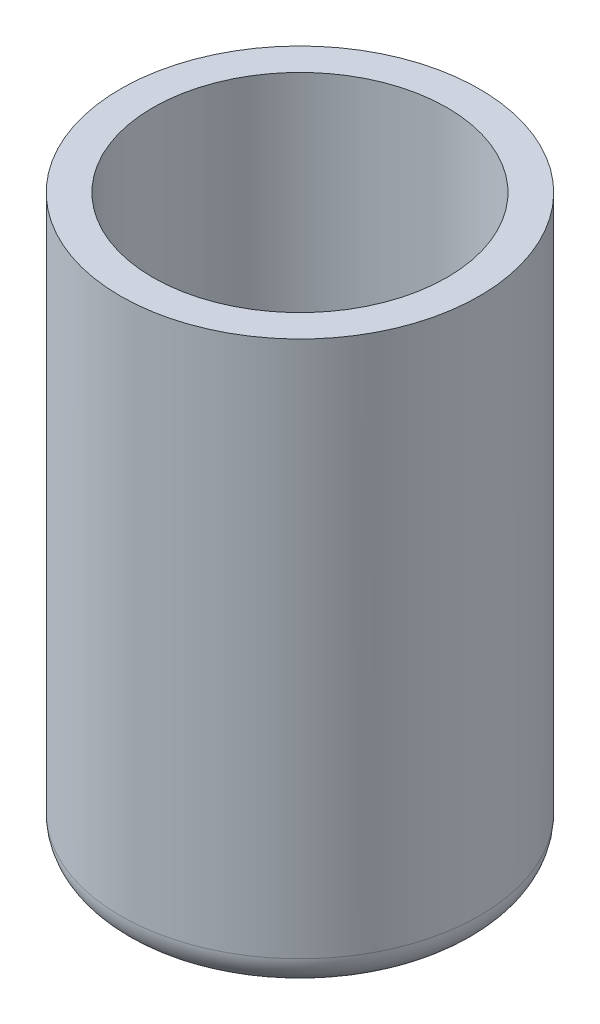
ISO-10303-21;
HEADER;
FILE_DESCRIPTION(('STEP AP214'),'2;1');
FILE_NAME('part.step','',(''),(''),'','','');
FILE_SCHEMA(('AUTOMOTIVE_DESIGN { 1 0 10303 214 1 1 1 1 }'));
ENDSEC;
DATA;
#1=APPLICATION_CONTEXT('core data for automotive mechanical design processes');
#2=APPLICATION_PROTOCOL_DEFINITION('international standard','automotive_design',2000,#1);
#3=PRODUCT_CONTEXT('',#1,'mechanical');
#4=PRODUCT('Part','Part','',(#3));
#5=PRODUCT_RELATED_PRODUCT_CATEGORY('part','',(#4));
#6=PRODUCT_DEFINITION_FORMATION('','',#4);
#7=PRODUCT_DEFINITION_CONTEXT('part definition',#1,'design');
#8=PRODUCT_DEFINITION('design','',#6,#7);
#9=PRODUCT_DEFINITION_SHAPE('','',#8);
#10=(LENGTH_UNIT() NAMED_UNIT(*) SI_UNIT(.MILLI.,.METRE.));
#11=(NAMED_UNIT(*) PLANE_ANGLE_UNIT() SI_UNIT($,.RADIAN.));
#12=(NAMED_UNIT(*) SI_UNIT($,.STERADIAN.) SOLID_ANGLE_UNIT());
#13=UNCERTAINTY_MEASURE_WITH_UNIT(LENGTH_MEASURE(1.E-05),#10,'distance_accuracy_value','');
#14=(GEOMETRIC_REPRESENTATION_CONTEXT(3) GLOBAL_UNCERTAINTY_ASSIGNED_CONTEXT((#13)) GLOBAL_UNIT_ASSIGNED_CONTEXT((#10,
#11,#12)) REPRESENTATION_CONTEXT('',''));
#15=CARTESIAN_POINT('',(0.,0.,0.));
#16=DIRECTION('',(0.,0.,1.));
#17=DIRECTION('',(1.,0.,0.));
#18=AXIS2_PLACEMENT_3D('',#15,#16,#17);
#19=CARTESIAN_POINT('',(0.,0.5,0.));
#20=DIRECTION('',(0.,1.,0.));
#21=DIRECTION('',(0.,0.,1.));
#22=AXIS2_PLACEMENT_3D('',#19,#20,#21);
#23=PLANE('',#22);
#24=CARTESIAN_POINT('',(0.,0.5,0.));
#25=DIRECTION('',(0.,-1.,0.));
#26=DIRECTION('',(0.,0.,-1.));
#27=AXIS2_PLACEMENT_3D('',#24,#25,#26);
#28=CIRCLE('',#27,1.5);
#29=CARTESIAN_POINT('',(0.,0.5,-1.5));
#30=VERTEX_POINT('',#29);
#31=EDGE_CURVE('E127',#30,#30,#28,.T.);
#32=ORIENTED_EDGE('',*,*,#31,.T.);
#33=EDGE_LOOP('',(#32));
#34=FACE_BOUND('',#33,.T.);
#35=CARTESIAN_POINT('',(0.,0.5,0.));
#36=DIRECTION('',(0.,1.,0.));
#37=DIRECTION('',(0.,0.,1.));
#38=AXIS2_PLACEMENT_3D('',#35,#36,#37);
#39=CIRCLE('',#38,2.275);
#40=CARTESIAN_POINT('',(0.,0.5,2.275));
#41=VERTEX_POINT('',#40);
#42=EDGE_CURVE('E50',#41,#41,#39,.T.);
#43=ORIENTED_EDGE('',*,*,#42,.T.);
#44=EDGE_LOOP('',(#43));
#45=FACE_BOUND('',#44,.T.);
#46=ADVANCED_FACE('F17',(#34,#45),#23,.T.);
#47=CARTESIAN_POINT('',(0.,0.,0.));
#48=DIRECTION('',(0.,-1.,0.));
#49=DIRECTION('',(0.,0.,-1.));
#50=AXIS2_PLACEMENT_3D('',#47,#48,#49);
#51=CYLINDRICAL_SURFACE('',#50,1.5);
#52=ORIENTED_EDGE('',*,*,#31,.F.);
#53=EDGE_LOOP('',(#52));
#54=FACE_BOUND('',#53,.T.);
#55=CARTESIAN_POINT('',(0.,0.,0.));
#56=DIRECTION('',(0.,-1.,0.));
#57=DIRECTION('',(0.,0.,-1.));
#58=AXIS2_PLACEMENT_3D('',#55,#56,#57);
#59=CIRCLE('',#58,1.5);
#60=CARTESIAN_POINT('',(0.,0.,-1.5));
#61=VERTEX_POINT('',#60);
#62=EDGE_CURVE('E120',#61,#61,#59,.T.);
#63=ORIENTED_EDGE('',*,*,#62,.T.);
#64=EDGE_LOOP('',(#63));
#65=FACE_BOUND('',#64,.T.);
#66=ADVANCED_FACE('F93',(#54,#65),#51,.F.);
#67=CARTESIAN_POINT('',(0.,8.8,0.));
#68=DIRECTION('',(0.,1.,0.));
#69=DIRECTION('',(0.,0.,1.));
#70=AXIS2_PLACEMENT_3D('',#67,#68,#69);
#71=CYLINDRICAL_SURFACE('',#70,2.275);
#72=ORIENTED_EDGE('',*,*,#42,.F.);
#73=EDGE_LOOP('',(#72));
#74=FACE_BOUND('',#73,.T.);
#75=CARTESIAN_POINT('',(0.,8.8,0.));
#76=DIRECTION('',(0.,1.,0.));
#77=DIRECTION('',(0.,0.,1.));
#78=AXIS2_PLACEMENT_3D('',#75,#76,#77);
#79=CIRCLE('',#78,2.275);
#80=CARTESIAN_POINT('',(0.,8.8,2.275));
#81=VERTEX_POINT('',#80);
#82=EDGE_CURVE('E115',#81,#81,#79,.F.);
#83=ORIENTED_EDGE('',*,*,#82,.F.);
#84=EDGE_LOOP('',(#83));
#85=FACE_BOUND('',#84,.T.);
#86=ADVANCED_FACE('F89',(#74,#85),#71,.F.);
#87=CARTESIAN_POINT('',(0.,0.,0.));
#88=DIRECTION('',(0.,1.,0.));
#89=DIRECTION('',(0.,0.,1.));
#90=AXIS2_PLACEMENT_3D('',#87,#88,#89);
#91=PLANE('',#90);
#92=ORIENTED_EDGE('',*,*,#62,.F.);
#93=EDGE_LOOP('',(#92));
#94=FACE_BOUND('',#93,.T.);
#95=DIRECTION('',(-0.00447098333713507,0.,-0.999990005104051));
#96=VECTOR('',#95,1.);
#97=CARTESIAN_POINT('',(-2.274909041772,0.,0.02034277072284));
#98=LINE('',#97,#96);
#99=CARTESIAN_POINT('',(-2.27499999538292,0.,2.657038677206E-12));
#100=VERTEX_POINT('',#99);
#101=CARTESIAN_POINT('',(-2.2749090417721,0.,0.0203427707228407));
#102=VERTEX_POINT('',#101);
#103=EDGE_CURVE('E45',#100,#102,#98,.F.);
#104=ORIENTED_EDGE('',*,*,#103,.F.);
#105=CARTESIAN_POINT('',(0.,0.,0.));
#106=DIRECTION('',(0.,1.,0.));
#107=DIRECTION('',(0.999960020616349,0.,-0.00894187726097398));
#108=AXIS2_PLACEMENT_3D('',#105,#106,#107);
#109=CIRCLE('',#108,2.2749999948696);
#110=CARTESIAN_POINT('',(2.2749090417722,0.,-0.0203427707228421));
#111=VERTEX_POINT('',#110);
#112=EDGE_CURVE('E36',#111,#100,#109,.T.);
#113=ORIENTED_EDGE('',*,*,#112,.F.);
#114=DIRECTION('',(0.00447098331750033,0.,0.999990005104138));
#115=VECTOR('',#114,1.);
#116=CARTESIAN_POINT('',(2.2749090417724,0.,-0.020342770722844));
#117=LINE('',#116,#115);
#118=CARTESIAN_POINT('',(2.27499999538288,0.,0.));
#119=VERTEX_POINT('',#118);
#120=EDGE_CURVE('E54',#119,#111,#117,.F.);
#121=ORIENTED_EDGE('',*,*,#120,.F.);
#122=CARTESIAN_POINT('',(-2.274909041772,0.,0.0203427707228401));
#123=CARTESIAN_POINT('',(-2.2749079122268,0.,0.0204690927999031));
#124=CARTESIAN_POINT('',(-2.27490677244794,0.,0.0205954148071511));
#125=CARTESIAN_POINT('',(-2.2749050309555,0.,0.0207867190812009));
#126=CARTESIAN_POINT('',(-2.27490443671498,0.,0.0208517014191717));
#127=CARTESIAN_POINT('',(-2.27490323172079,0.,0.0209828803077453));
#128=CARTESIAN_POINT('',(-2.27490262086606,0.,0.0210490768572435));
#129=CARTESIAN_POINT('',(-2.27455822120284,0.,0.0581948890568414));
#130=CARTESIAN_POINT('',(-2.27330749189729,5.01028851318519E-13,0.0952724837145068));
#131=CARTESIAN_POINT('',(-2.2689951644455,2.41395760941737E-12,0.169318804758169));
#132=CARTESIAN_POINT('',(-2.265933565353,3.82638218425559E-12,0.206287531087268));
#133=CARTESIAN_POINT('',(-2.25800680962578,7.47252325800651E-12,0.280032057933253));
#134=CARTESIAN_POINT('',(-2.25314165207901,9.70624017224398E-12,0.316807858352568));
#135=CARTESIAN_POINT('',(-2.24161941264226,1.49084030212427E-11,0.390077436430768));
#136=CARTESIAN_POINT('',(-2.2349623298763,1.78768493151786E-11,0.426571213951776));
#137=CARTESIAN_POINT('',(-2.21987215538289,2.44647165221028E-11,0.499189797518696));
#138=CARTESIAN_POINT('',(-2.21143906281715,2.80841377423574E-11,0.53531460339044));
#139=CARTESIAN_POINT('',(-2.1928170316152,3.58931163501653E-11,0.607108781864574));
#140=CARTESIAN_POINT('',(-2.18262809217979,4.00826739972251E-11,0.642778154259658));
#141=CARTESIAN_POINT('',(-2.1605187278213,4.89539619154424E-11,0.713576199939319));
#142=CARTESIAN_POINT('',(-2.14859830213927,5.36356924023301E-11,0.748704872986889));
#143=CARTESIAN_POINT('',(-2.12305446837299,6.34165109238919E-11,0.81833751404088));
#144=CARTESIAN_POINT('',(-2.10943105957096,6.85155991344733E-11,0.852841481783993));
#145=CARTESIAN_POINT('',(-2.08050057963175,7.90638936991614E-11,0.921173512521581));
#146=CARTESIAN_POINT('',(-2.06519197671435,8.45134166836478E-11,0.955000927001486));
#147=CARTESIAN_POINT('',(-2.03293796813301,9.56890096483312E-11,1.02186621899016));
#148=CARTESIAN_POINT('',(-2.01599256183378,1.01415079735865E-10,1.05490409619248));
#149=CARTESIAN_POINT('',(-1.9805055361723,1.13077625541851E-10,1.12011117547151));
#150=CARTESIAN_POINT('',(-1.96196391621744,1.19014101338419E-10,1.15228037722571));
#151=CARTESIAN_POINT('',(-1.92332887841285,1.31033929948697E-10,1.21567304339729));
#152=CARTESIAN_POINT('',(-1.90323546001318,1.37117282814459E-10,1.2468965074795));
#153=CARTESIAN_POINT('',(-1.86154495740937,1.49370566587445E-10,1.30832290287883));
#154=CARTESIAN_POINT('',(-1.83994787269772,1.55540497523891E-10,1.3385258338515));
#155=CARTESIAN_POINT('',(-1.79530177176338,1.67909321736227E-10,1.39783881189381));
#156=CARTESIAN_POINT('',(-1.77225275507514,1.74108215021403E-10,1.42694885861303));
#157=CARTESIAN_POINT('',(-1.72475800259924,1.86480515872509E-10,1.48400633507037));
#158=CARTESIAN_POINT('',(-1.70031226638731,1.92653923430696E-10,1.51195376445531));
#159=CARTESIAN_POINT('',(-1.65008263317409,2.04923665501069E-10,1.56661905815625));
#160=CARTESIAN_POINT('',(-1.62429873578891,2.11019999991144E-10,1.5933369221195));
#161=CARTESIAN_POINT('',(-1.57145454414962,2.23086962085974E-10,1.64547908229039));
#162=CARTESIAN_POINT('',(-1.54439424955088,2.29057589656785E-10,1.67090337814876));
#163=CARTESIAN_POINT('',(-1.48906208506205,2.40827393451631E-10,1.72039749813877));
#164=CARTESIAN_POINT('',(-1.46079021486527,2.46626569632263E-10,1.74446732192754));
#165=CARTESIAN_POINT('',(-1.40310262313302,2.58010779246847E-10,1.79119483842491));
#166=CARTESIAN_POINT('',(-1.37368690132732,2.63595812630203E-10,1.81385253079987));
#167=CARTESIAN_POINT('',(-1.31378207047109,2.7451194136831E-10,1.85770150786038));
#168=CARTESIAN_POINT('',(-1.28329296118508,2.79843036667347E-10,1.87889279222421));
#169=CARTESIAN_POINT('',(-1.2213143908048,2.90214420483579E-10,1.91975818942127));
#170=CARTESIAN_POINT('',(-1.18982492950793,2.95254708941879E-10,1.93943230194723));
#171=CARTESIAN_POINT('',(-1.12592108692678,3.05010572153766E-10,1.97721622600387));
#172=CARTESIAN_POINT('',(-1.0935067054708,3.0972614684707E-10,1.99532603724414));
#173=CARTESIAN_POINT('',(-1.02783067007742,3.18801682660338E-10,2.0299379765435));
#174=CARTESIAN_POINT('',(-0.994569015997028,3.23161643720283E-10,2.04644010433125));
#175=CARTESIAN_POINT('',(-0.927278112538879,3.31497843256083E-10,2.07779714574377));
#176=CARTESIAN_POINT('',(-0.893248863044526,3.35474081673652E-10,2.09265205911833));
#177=CARTESIAN_POINT('',(-0.82450428475113,3.43017903653596E-10,2.12067908662632));
#178=CARTESIAN_POINT('',(-0.78978895585945,3.46585487160794E-10,2.13385120053254));
#179=CARTESIAN_POINT('',(-0.719755378298236,3.53289783820274E-10,2.15848107517621));
#180=CARTESIAN_POINT('',(-0.684437129557468,3.56426496921648E-10,2.16993883571111));
#181=CARTESIAN_POINT('',(-0.613282316147296,3.62249923831323E-10,2.19111255642495));
#182=CARTESIAN_POINT('',(-0.5774457514254,3.64936637594049E-10,2.2008285164275));
#183=CARTESIAN_POINT('',(-0.505340151552807,3.69843871619921E-10,2.21849536138185));
#184=CARTESIAN_POINT('',(-0.469071116365609,3.72064391843719E-10,2.22644624618469));
#185=CARTESIAN_POINT('',(-0.396187457066522,3.76026000006789E-10,2.2405638942937));
#186=CARTESIAN_POINT('',(-0.359572832931298,3.77767087913686E-10,2.2467306574794));
#187=CARTESIAN_POINT('',(-0.28608570511639,3.80759400310325E-10,2.25726528978445));
#188=CARTESIAN_POINT('',(-0.249213201423644,3.82010624775254E-10,2.26163315881267));
#189=CARTESIAN_POINT('',(-0.175298641638568,3.84015940355227E-10,2.26855953949825));
#190=CARTESIAN_POINT('',(-0.138256585540511,3.84770031453478E-10,2.27111805109448));
#191=CARTESIAN_POINT('',(-0.0640916542629599,3.85776572508734E-10,2.27441958794257));
#192=CARTESIAN_POINT('',(-0.0269687790820996,3.86029022457259E-10,2.27516261316374));
#193=CARTESIAN_POINT('',(0.0472688634340816,3.860309108888E-10,2.27483139730175));
#194=CARTESIAN_POINT('',(0.0843836307694023,3.85780349371801E-10,2.27375715621855));
#195=CARTESIAN_POINT('',(0.158516150086931,3.84777530292941E-10,2.26979398106568));
#196=CARTESIAN_POINT('',(0.195533902070773,3.84025272739529E-10,2.26690504702657));
#197=CARTESIAN_POINT('',(0.26938371557892,3.82023626955579E-10,2.25931940639308));
#198=CARTESIAN_POINT('',(0.306215777109486,3.80774238741803E-10,2.25462269985965));
#199=CARTESIAN_POINT('',(0.3796059794308,3.77785642908933E-10,2.2434327652038));
#200=CARTESIAN_POINT('',(0.416164120235404,3.7604643531462E-10,2.23693953717227));
#201=CARTESIAN_POINT('',(0.488918907010033,3.72088408824714E-10,2.22217211406921));
#202=CARTESIAN_POINT('',(0.525115553004445,3.69869589961477E-10,2.21389791911784));
#203=CARTESIAN_POINT('',(0.597060642036865,3.64965779882122E-10,2.19558838304484));
#204=CARTESIAN_POINT('',(0.632809085112674,3.6228078870532E-10,2.18555304207174));
#205=CARTESIAN_POINT('',(0.703772133871904,3.56460684177648E-10,2.16374525366356));
#206=CARTESIAN_POINT('',(0.738986739609356,3.53325570872337E-10,2.15197280640429));
#207=CARTESIAN_POINT('',(0.808797758082489,3.46624510058231E-10,2.12671900638175));
#208=CARTESIAN_POINT('',(0.84339417089117,3.43058562600313E-10,2.11323765382027));
#209=CARTESIAN_POINT('',(0.911885928801196,3.35517773655512E-10,2.08459833784368));
#210=CARTESIAN_POINT('',(0.945781273997157,3.31542932223813E-10,2.06944037465484));
#211=CARTESIAN_POINT('',(1.01278970140954,3.23209579298475E-10,2.03748414840213));
#212=CARTESIAN_POINT('',(1.04590278374474,3.18851067863091E-10,2.02068588558731));
#213=CARTESIAN_POINT('',(1.11126736410305,3.09778242967149E-10,1.98548930040403));
#214=CARTESIAN_POINT('',(1.14351886227152,3.05063929566618E-10,1.96709097830551));
#215=CARTESIAN_POINT('',(1.20708301692058,2.95310422267054E-10,1.92873834782043));
#216=CARTESIAN_POINT('',(1.23839567357539,2.90271228428312E-10,1.90878403972263));
#217=CARTESIAN_POINT('',(1.3000071368507,2.79902021514089E-10,1.86736723786824));
#218=CARTESIAN_POINT('',(1.33030594367645,2.74572008497486E-10,1.84590474441699));
#219=CARTESIAN_POINT('',(1.38981712766148,2.63657826665094E-10,1.80152298533882));
#220=CARTESIAN_POINT('',(1.41902950505903,2.58073657905049E-10,1.77860372003142));
#221=CARTESIAN_POINT('',(1.47629785313637,2.46690976308572E-10,1.73136332041339));
#222=CARTESIAN_POINT('',(1.5043538240893,2.40892463522769E-10,1.7070421864339));
#223=CARTESIAN_POINT('',(1.55924215243888,2.29123924888423E-10,1.6570563108091));
#224=CARTESIAN_POINT('',(1.58607451014519,2.23153899083287E-10,1.63139156950383));
#225=CARTESIAN_POINT('',(1.63845133637134,2.11087937743574E-10,1.57877995916086));
#226=CARTESIAN_POINT('',(1.66399580523885,2.04992002242988E-10,1.55183309046926));
#227=CARTESIAN_POINT('',(1.71373566333907,1.92722846683345E-10,1.49672177660362));
#228=CARTESIAN_POINT('',(1.73793105295873,1.86549626646456E-10,1.4685573317788));
#229=CARTESIAN_POINT('',(1.78491479387946,1.74177448444257E-10,1.41107833357644));
#230=CARTESIAN_POINT('',(1.80770314560785,1.67978490286765E-10,1.38176378054819));
#231=CARTESIAN_POINT('',(1.85181822266759,1.55609456329772E-10,1.3220547889246));
#232=CARTESIAN_POINT('',(1.8731449484675,1.49439380521013E-10,1.29166035067545));
#233=CARTESIAN_POINT('',(1.91428568696252,1.37185512035207E-10,1.2298643984278));
#234=CARTESIAN_POINT('',(1.93409970016809,1.31101719329044E-10,1.19846288476914));
#235=CARTESIAN_POINT('',(1.97216755051832,1.19080753027284E-10,1.13472800393187));
#236=CARTESIAN_POINT('',(1.99042138821577,1.13143579379738E-10,1.10239463708345));
#237=CARTESIAN_POINT('',(2.02532516203188,1.01479446999039E-10,1.03687350430763));
#238=CARTESIAN_POINT('',(2.04197509874591,9.57524881878573E-11,1.00368573869738));
#239=CARTESIAN_POINT('',(2.07363118729849,8.45748382344395E-11,0.936535309505449));
#240=CARTESIAN_POINT('',(2.08863733977496,7.91241469849933E-11,0.902572646224481));
#241=CARTESIAN_POINT('',(2.11696991416989,6.85684771734286E-11,0.833953779008327));
#242=CARTESIAN_POINT('',(2.13029633676854,6.34634984713165E-11,0.799297575353994));
#243=CARTESIAN_POINT('',(2.15523752999224,5.36713210645016E-11,0.729374646048543));
#244=CARTESIAN_POINT('',(2.1668523013393,4.89841221835721E-11,0.69410792065496));
#245=CARTESIAN_POINT('',(2.1883423693376,4.01028207137349E-11,0.623048428892711));
#246=CARTESIAN_POINT('',(2.19821766675193,3.590871790851E-11,0.587255662754823));
#247=CARTESIAN_POINT('',(2.21620513711461,2.80915212735056E-11,0.515229830883956));
#248=CARTESIAN_POINT('',(2.22431731086618,2.44684271835938E-11,0.478996765351572));
#249=CARTESIAN_POINT('',(2.23875908532877,1.78744396991616E-11,0.406177129639672));
#250=CARTESIAN_POINT('',(2.24508868688195,1.49035459965153E-11,0.369590559627175));
#251=CARTESIAN_POINT('',(2.25595022217074,9.69786993252926E-12,0.296151560744809));
#252=CARTESIAN_POINT('',(2.26048215678597,7.46308721099924E-12,0.259299132005038));
#253=CARTESIAN_POINT('',(2.26773725771941,3.8165194335997E-12,0.185416682949238));
#254=CARTESIAN_POINT('',(2.2704604249532,2.40473396113735E-12,0.148386662723113));
#255=CARTESIAN_POINT('',(2.27409238813714,4.9463998807478E-13,0.074237780384874));
#256=CARTESIAN_POINT('',(2.27500118503632,0.,0.0371189183192395));
#257=CARTESIAN_POINT('',(2.27499999487,0.,0.));
#258=B_SPLINE_CURVE_WITH_KNOTS('',3,(#122,#123,#124,#125,#126,#127,#128,#129,#130,#131,#132,
#133,#134,#135,#136,#137,#138,#139,#140,#141,#142,#143,#144,#145,#146,#147,#148,#149,#150,#151,
#152,#153,#154,#155,#156,#157,#158,#159,#160,#161,#162,#163,#164,#165,#166,#167,#168,#169,#170,
#171,#172,#173,#174,#175,#176,#177,#178,#179,#180,#181,#182,#183,#184,#185,#186,#187,#188,#189,
#190,#191,#192,#193,#194,#195,#196,#197,#198,#199,#200,#201,#202,#203,#204,#205,#206,#207,#208,
#209,#210,#211,#212,#213,#214,#215,#216,#217,#218,#219,#220,#221,#222,#223,#224,#225,#226,#227,
#228,#229,#230,#231,#232,#233,#234,#235,#236,#237,#238,#239,#240,#241,#242,#243,#244,#245,#246,
#247,#248,#249,#250,#251,#252,#253,#254,#255,#256,#257),.UNSPECIFIED.,.F.,.F.,(4,2,2,2,2,2,2,2,
2,2,2,2,2,2,2,2,2,2,2,2,2,2,2,2,2,2,2,2,2,2,2,2,2,2,2,2,2,2,2,2,2,2,2,2,2,2,2,2,2,2,2,2,2,2,2,2,
2,2,2,2,2,2,2,2,2,2,2,4),(0.,0.000378981419826364,0.000573936580988481,0.000772534709615643,
0.11201614260098,0.223259808621649,0.334503530897943,0.445747307556157,0.556991136722589,
0.668235016523547,0.779478945085332,0.890722920534248,1.0020688609433,1.11341484456947,
1.22476086953389,1.33610693395771,1.44745303596209,1.55879917366816,1.67014534519707,
1.78149154866998,1.89283778220803,2.00418404393237,2.11553033196414,2.22687664442449,
2.33822297943458,2.44956933511553,2.56091570958852,2.67226210097467,2.78360850739515,
2.89495492697109,3.00630135782365,3.11764779807397,3.2289942458432,3.34034069925248,
3.45168715642297,3.56303361547581,3.67438007453215,3.78572653171314,3.89707298513992,
4.00841943293364,4.11976587321545,4.23111230410649,4.34245872372793,4.45380513020089,
4.56515152164652,4.67649789618599,4.78784425194043,4.89919058703099,5.01053689957882,
5.12188318770506,5.23322944953087,5.34457568317738,5.45592188676576,5.56726805841714,
5.67861419625268,5.78996029839351,5.90130636296079,6.01265238807567,6.12399837185929,
6.2353443124328,6.34669020791735,6.45803605643408,6.56938185610416,6.6807276050487,
6.79207330138887,6.90341894324582,7.0147645287407,7.12611005599463),.UNSPECIFIED.);
#259=EDGE_CURVE('E47',#102,#119,#258,.T.);
#260=ORIENTED_EDGE('',*,*,#259,.F.);
#261=EDGE_LOOP('',(#104,#113,#121,#260));
#262=FACE_BOUND('',#261,.T.);
#263=ADVANCED_FACE('F46',(#94,#262),#91,.F.);
#264=CARTESIAN_POINT('',(0.,8.8,0.));
#265=DIRECTION('',(0.,1.,0.));
#266=DIRECTION('',(0.,0.,1.));
#267=AXIS2_PLACEMENT_3D('',#264,#265,#266);
#268=PLANE('',#267);
#269=ORIENTED_EDGE('',*,*,#82,.T.);
#270=EDGE_LOOP('',(#269));
#271=FACE_BOUND('',#270,.T.);
#272=CARTESIAN_POINT('',(0.,8.8,0.));
#273=DIRECTION('',(0.,1.,0.));
#274=DIRECTION('',(0.,0.,1.));
#275=AXIS2_PLACEMENT_3D('',#272,#273,#274);
#276=CIRCLE('',#275,2.775);
#277=CARTESIAN_POINT('',(0.,8.8,2.775));
#278=VERTEX_POINT('',#277);
#279=EDGE_CURVE('E28',#278,#278,#276,.F.);
#280=ORIENTED_EDGE('',*,*,#279,.F.);
#281=EDGE_LOOP('',(#280));
#282=FACE_BOUND('',#281,.T.);
#283=ADVANCED_FACE('F74',(#271,#282),#268,.T.);
#284=CARTESIAN_POINT('',(0.,0.5,0.));
#285=DIRECTION('',(0.,1.,0.));
#286=DIRECTION('',(-0.99995692651868,0.,0.00928143886016881));
#287=AXIS2_PLACEMENT_3D('',#284,#285,#286);
#288=TOROIDAL_SURFACE('',#287,2.275,0.5);
#289=CARTESIAN_POINT('',(0.,0.5,0.));
#290=DIRECTION('',(0.,1.,0.));
#291=DIRECTION('',(0.,0.,1.));
#292=AXIS2_PLACEMENT_3D('',#289,#290,#291);
#293=CIRCLE('',#292,2.775);
#294=CARTESIAN_POINT('',(0.,0.5,2.775));
#295=VERTEX_POINT('',#294);
#296=EDGE_CURVE('E11',#295,#295,#293,.T.);
#297=ORIENTED_EDGE('',*,*,#296,.F.);
#298=EDGE_LOOP('',(#297));
#299=FACE_BOUND('',#298,.T.);
#300=ORIENTED_EDGE('',*,*,#120,.T.);
#301=ORIENTED_EDGE('',*,*,#112,.T.);
#302=ORIENTED_EDGE('',*,*,#103,.T.);
#303=ORIENTED_EDGE('',*,*,#259,.T.);
#304=EDGE_LOOP('',(#300,#301,#302,#303));
#305=FACE_BOUND('',#304,.T.);
#306=ADVANCED_FACE('F53',(#299,#305),#288,.T.);
#307=CARTESIAN_POINT('',(0.,0.,0.));
#308=DIRECTION('',(0.,1.,0.));
#309=DIRECTION('',(0.,0.,1.));
#310=AXIS2_PLACEMENT_3D('',#307,#308,#309);
#311=CYLINDRICAL_SURFACE('',#310,2.775);
#312=ORIENTED_EDGE('',*,*,#279,.T.);
#313=EDGE_LOOP('',(#312));
#314=FACE_BOUND('',#313,.T.);
#315=ORIENTED_EDGE('',*,*,#296,.T.);
#316=EDGE_LOOP('',(#315));
#317=FACE_BOUND('',#316,.T.);
#318=ADVANCED_FACE('F73',(#314,#317),#311,.T.);
#319=CLOSED_SHELL('',(#46,#66,#86,#263,#283,#306,#318));
#320=MANIFOLD_SOLID_BREP('B1',#319);
#321=ADVANCED_BREP_SHAPE_REPRESENTATION('',(#18,#320),#14);
#322=SHAPE_DEFINITION_REPRESENTATION(#9,#321);
ENDSEC;
END-ISO-10303-21;
